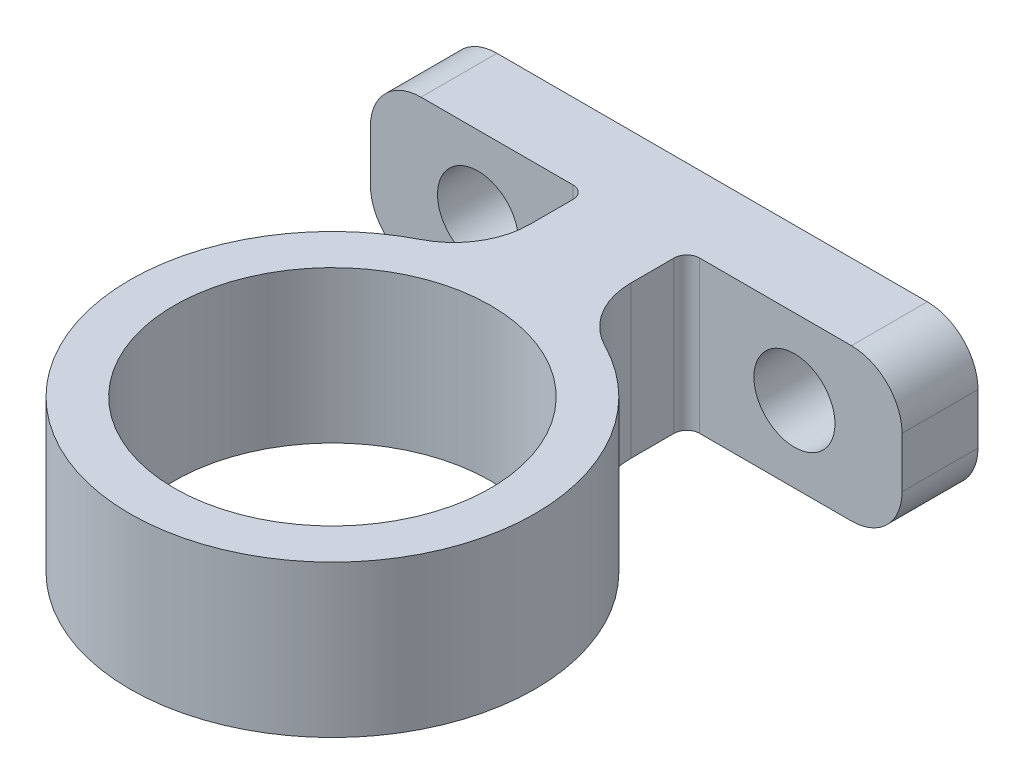
ISO-10303-21;
HEADER;
FILE_DESCRIPTION(('STEP AP214'),'2;1');
FILE_NAME('part.step','',(''),(''),'','','');
FILE_SCHEMA(('AUTOMOTIVE_DESIGN { 1 0 10303 214 1 1 1 1 }'));
ENDSEC;
DATA;
#1=APPLICATION_CONTEXT('core data for automotive mechanical design processes');
#2=APPLICATION_PROTOCOL_DEFINITION('international standard','automotive_design',2000,#1);
#3=PRODUCT_CONTEXT('',#1,'mechanical');
#4=PRODUCT('Part','Part','',(#3));
#5=PRODUCT_RELATED_PRODUCT_CATEGORY('part','',(#4));
#6=PRODUCT_DEFINITION_FORMATION('','',#4);
#7=PRODUCT_DEFINITION_CONTEXT('part definition',#1,'design');
#8=PRODUCT_DEFINITION('design','',#6,#7);
#9=PRODUCT_DEFINITION_SHAPE('','',#8);
#10=(LENGTH_UNIT() NAMED_UNIT(*) SI_UNIT(.MILLI.,.METRE.));
#11=(NAMED_UNIT(*) PLANE_ANGLE_UNIT() SI_UNIT($,.RADIAN.));
#12=(NAMED_UNIT(*) SI_UNIT($,.STERADIAN.) SOLID_ANGLE_UNIT());
#13=UNCERTAINTY_MEASURE_WITH_UNIT(LENGTH_MEASURE(1.E-05),#10,'distance_accuracy_value','');
#14=(GEOMETRIC_REPRESENTATION_CONTEXT(3) GLOBAL_UNCERTAINTY_ASSIGNED_CONTEXT((#13)) GLOBAL_UNIT_ASSIGNED_CONTEXT((#10,
#11,#12)) REPRESENTATION_CONTEXT('',''));
#15=CARTESIAN_POINT('',(0.,0.,0.));
#16=DIRECTION('',(0.,0.,1.));
#17=DIRECTION('',(1.,0.,0.));
#18=AXIS2_PLACEMENT_3D('',#15,#16,#17);
#19=CARTESIAN_POINT('',(0.,0.,3.));
#20=DIRECTION('',(0.,0.,1.));
#21=DIRECTION('',(1.,0.,0.));
#22=AXIS2_PLACEMENT_3D('',#19,#20,#21);
#23=PLANE('',#22);
#24=CARTESIAN_POINT('',(6.25,-30.2064932101433,3.));
#25=DIRECTION('',(0.,0.,1.));
#26=DIRECTION('',(1.,0.,0.));
#27=AXIS2_PLACEMENT_3D('',#24,#25,#26);
#28=CIRCLE('',#27,1.6);
#29=CARTESIAN_POINT('',(7.85,-30.2064932101433,3.));
#30=VERTEX_POINT('',#29);
#31=EDGE_CURVE('E346',#30,#30,#28,.F.);
#32=ORIENTED_EDGE('',*,*,#31,.T.);
#33=EDGE_LOOP('',(#32));
#34=FACE_BOUND('',#33,.T.);
#35=DIRECTION('',(0.,1.,0.));
#36=VECTOR('',#35,1.);
#37=CARTESIAN_POINT('',(10.5,-33.2064932101433,3.));
#38=LINE('',#37,#36);
#39=CARTESIAN_POINT('',(10.5,-31.2064932101433,3.));
#40=VERTEX_POINT('',#39);
#41=CARTESIAN_POINT('',(10.5,-29.2064932101433,3.));
#42=VERTEX_POINT('',#41);
#43=EDGE_CURVE('E282',#40,#42,#38,.T.);
#44=ORIENTED_EDGE('',*,*,#43,.T.);
#45=CARTESIAN_POINT('',(8.50000000000001,-29.2064932101433,3.));
#46=DIRECTION('',(0.,0.,1.));
#47=DIRECTION('',(1.,0.,0.));
#48=AXIS2_PLACEMENT_3D('',#45,#46,#47);
#49=CIRCLE('',#48,2.);
#50=CARTESIAN_POINT('',(8.50000000000001,-27.2064932101433,3.));
#51=VERTEX_POINT('',#50);
#52=EDGE_CURVE('E181',#42,#51,#49,.T.);
#53=ORIENTED_EDGE('',*,*,#52,.T.);
#54=DIRECTION('',(-1.,0.,0.));
#55=VECTOR('',#54,1.);
#56=CARTESIAN_POINT('',(10.5,-27.2064932101433,3.));
#57=LINE('',#56,#55);
#58=CARTESIAN_POINT('',(2.5,-27.2064932101433,3.));
#59=VERTEX_POINT('',#58);
#60=EDGE_CURVE('E173',#51,#59,#57,.T.);
#61=ORIENTED_EDGE('',*,*,#60,.T.);
#62=DIRECTION('',(0.,-1.,0.));
#63=VECTOR('',#62,1.);
#64=CARTESIAN_POINT('',(2.5,0.,3.));
#65=LINE('',#64,#63);
#66=CARTESIAN_POINT('',(2.5,-33.2064932101433,3.));
#67=VERTEX_POINT('',#66);
#68=EDGE_CURVE('E178',#59,#67,#65,.T.);
#69=ORIENTED_EDGE('',*,*,#68,.T.);
#70=DIRECTION('',(1.,0.,0.));
#71=VECTOR('',#70,1.);
#72=CARTESIAN_POINT('',(10.5,-33.2064932101433,3.));
#73=LINE('',#72,#71);
#74=CARTESIAN_POINT('',(8.50000000000001,-33.2064932101433,3.));
#75=VERTEX_POINT('',#74);
#76=EDGE_CURVE('E207',#67,#75,#73,.T.);
#77=ORIENTED_EDGE('',*,*,#76,.T.);
#78=CARTESIAN_POINT('',(8.50000000000001,-31.2064932101433,3.));
#79=DIRECTION('',(0.,0.,1.));
#80=DIRECTION('',(1.,0.,0.));
#81=AXIS2_PLACEMENT_3D('',#78,#79,#80);
#82=CIRCLE('',#81,2.);
#83=EDGE_CURVE('E257',#75,#40,#82,.T.);
#84=ORIENTED_EDGE('',*,*,#83,.T.);
#85=EDGE_LOOP('',(#44,#53,#61,#69,#77,#84));
#86=FACE_BOUND('',#85,.T.);
#87=ADVANCED_FACE('F58',(#34,#86),#23,.T.);
#88=CARTESIAN_POINT('',(10.5,-33.2064932101433,3.));
#89=DIRECTION('',(-1.,0.,0.));
#90=DIRECTION('',(0.,0.,1.));
#91=AXIS2_PLACEMENT_3D('',#88,#89,#90);
#92=PLANE('',#91);
#93=DIRECTION('',(0.,1.,0.));
#94=VECTOR('',#93,1.);
#95=CARTESIAN_POINT('',(10.5,-33.2064932101433,0.));
#96=LINE('',#95,#94);
#97=CARTESIAN_POINT('',(10.5,-31.2064932101433,0.));
#98=VERTEX_POINT('',#97);
#99=CARTESIAN_POINT('',(10.5,-29.2064932101433,0.));
#100=VERTEX_POINT('',#99);
#101=EDGE_CURVE('E280',#98,#100,#96,.T.);
#102=ORIENTED_EDGE('',*,*,#101,.T.);
#103=DIRECTION('',(0.,0.,-1.));
#104=VECTOR('',#103,1.);
#105=CARTESIAN_POINT('',(10.5,-29.2064932101433,3.));
#106=LINE('',#105,#104);
#107=EDGE_CURVE('E255',#100,#42,#106,.F.);
#108=ORIENTED_EDGE('',*,*,#107,.T.);
#109=ORIENTED_EDGE('',*,*,#43,.F.);
#110=DIRECTION('',(0.,0.,-1.));
#111=VECTOR('',#110,1.);
#112=CARTESIAN_POINT('',(10.5,-31.2064932101433,3.));
#113=LINE('',#112,#111);
#114=EDGE_CURVE('E252',#40,#98,#113,.T.);
#115=ORIENTED_EDGE('',*,*,#114,.T.);
#116=EDGE_LOOP('',(#102,#108,#109,#115));
#117=FACE_BOUND('',#116,.T.);
#118=ADVANCED_FACE('F279',(#117),#92,.F.);
#119=CARTESIAN_POINT('',(10.5,-27.2064932101433,3.));
#120=DIRECTION('',(0.,-1.,0.));
#121=DIRECTION('',(0.,0.,-1.));
#122=AXIS2_PLACEMENT_3D('',#119,#120,#121);
#123=PLANE('',#122);
#124=ORIENTED_EDGE('',*,*,#60,.F.);
#125=DIRECTION('',(0.,0.,-1.));
#126=VECTOR('',#125,1.);
#127=CARTESIAN_POINT('',(8.50000000000001,-27.2064932101433,3.));
#128=LINE('',#127,#126);
#129=CARTESIAN_POINT('',(8.50000000000001,-27.2064932101433,0.));
#130=VERTEX_POINT('',#129);
#131=EDGE_CURVE('E242',#51,#130,#128,.T.);
#132=ORIENTED_EDGE('',*,*,#131,.T.);
#133=DIRECTION('',(-1.,0.,0.));
#134=VECTOR('',#133,1.);
#135=CARTESIAN_POINT('',(10.5,-27.2064932101433,0.));
#136=LINE('',#135,#134);
#137=CARTESIAN_POINT('',(-8.49999999999999,-27.2064932101433,0.));
#138=VERTEX_POINT('',#137);
#139=EDGE_CURVE('E286',#130,#138,#136,.T.);
#140=ORIENTED_EDGE('',*,*,#139,.T.);
#141=DIRECTION('',(0.,0.,-1.));
#142=VECTOR('',#141,1.);
#143=CARTESIAN_POINT('',(-8.5,-27.2064932101433,3.));
#144=LINE('',#143,#142);
#145=CARTESIAN_POINT('',(-8.49999999999999,-27.2064932101433,3.));
#146=VERTEX_POINT('',#145);
#147=EDGE_CURVE('E240',#138,#146,#144,.F.);
#148=ORIENTED_EDGE('',*,*,#147,.T.);
#149=CARTESIAN_POINT('',(-2.5,-27.2064932101433,3.));
#150=VERTEX_POINT('',#149);
#151=EDGE_CURVE('E186',#150,#146,#57,.T.);
#152=ORIENTED_EDGE('',*,*,#151,.F.);
#153=CARTESIAN_POINT('',(-2.5,-27.2064932101433,3.5));
#154=DIRECTION('',(0.,-1.,0.));
#155=DIRECTION('',(0.,0.,-1.));
#156=AXIS2_PLACEMENT_3D('',#153,#154,#155);
#157=CIRCLE('',#156,0.5);
#158=CARTESIAN_POINT('',(-2.,-27.2064932101433,3.5));
#159=VERTEX_POINT('',#158);
#160=EDGE_CURVE('E220',#150,#159,#157,.T.);
#161=ORIENTED_EDGE('',*,*,#160,.T.);
#162=DIRECTION('',(0.,0.,1.));
#163=VECTOR('',#162,1.);
#164=CARTESIAN_POINT('',(-2.,-27.2064932101433,0.));
#165=LINE('',#164,#163);
#166=CARTESIAN_POINT('',(-2.,-27.2064932101433,5.20204102886729));
#167=VERTEX_POINT('',#166);
#168=EDGE_CURVE('E287',#159,#167,#165,.T.);
#169=ORIENTED_EDGE('',*,*,#168,.T.);
#170=CARTESIAN_POINT('',(-5.,-27.2064932101433,5.20204102886729));
#171=DIRECTION('',(0.,-1.,0.));
#172=DIRECTION('',(0.,0.,-1.));
#173=AXIS2_PLACEMENT_3D('',#170,#171,#172);
#174=CIRCLE('',#173,3.);
#175=CARTESIAN_POINT('',(-3.63636363636364,-27.2064932101433,7.87421165735803));
#176=VERTEX_POINT('',#175);
#177=EDGE_CURVE('E234',#167,#176,#174,.T.);
#178=ORIENTED_EDGE('',*,*,#177,.T.);
#179=CARTESIAN_POINT('',(0.,-27.2064932101433,15.));
#180=DIRECTION('',(0.,-1.,0.));
#181=DIRECTION('',(0.,0.,-1.));
#182=AXIS2_PLACEMENT_3D('',#179,#180,#181);
#183=CIRCLE('',#182,8.);
#184=CARTESIAN_POINT('',(3.63636363636364,-27.2064932101433,7.87421165735803));
#185=VERTEX_POINT('',#184);
#186=EDGE_CURVE('E355',#176,#185,#183,.F.);
#187=ORIENTED_EDGE('',*,*,#186,.T.);
#188=CARTESIAN_POINT('',(5.,-27.2064932101433,5.20204102886729));
#189=DIRECTION('',(0.,-1.,0.));
#190=DIRECTION('',(0.,0.,-1.));
#191=AXIS2_PLACEMENT_3D('',#188,#189,#190);
#192=CIRCLE('',#191,3.);
#193=CARTESIAN_POINT('',(2.,-27.2064932101433,5.20204102886729));
#194=VERTEX_POINT('',#193);
#195=EDGE_CURVE('E238',#185,#194,#192,.T.);
#196=ORIENTED_EDGE('',*,*,#195,.T.);
#197=DIRECTION('',(0.,0.,1.));
#198=VECTOR('',#197,1.);
#199=CARTESIAN_POINT('',(2.,-27.2064932101433,0.));
#200=LINE('',#199,#198);
#201=CARTESIAN_POINT('',(2.,-27.2064932101433,3.5));
#202=VERTEX_POINT('',#201);
#203=EDGE_CURVE('E194',#202,#194,#200,.T.);
#204=ORIENTED_EDGE('',*,*,#203,.F.);
#205=CARTESIAN_POINT('',(2.5,-27.2064932101433,3.5));
#206=DIRECTION('',(0.,-1.,0.));
#207=DIRECTION('',(0.,0.,-1.));
#208=AXIS2_PLACEMENT_3D('',#205,#206,#207);
#209=CIRCLE('',#208,0.5);
#210=EDGE_CURVE('E190',#202,#59,#209,.T.);
#211=ORIENTED_EDGE('',*,*,#210,.T.);
#212=EDGE_LOOP('',(#124,#132,#140,#148,#152,#161,#169,#178,#187,#196,#204,#211));
#213=FACE_BOUND('',#212,.T.);
#214=CARTESIAN_POINT('',(0.,-27.2064932101433,15.));
#215=DIRECTION('',(0.,-1.,0.));
#216=DIRECTION('',(0.,0.,-1.));
#217=AXIS2_PLACEMENT_3D('',#214,#215,#216);
#218=CIRCLE('',#217,6.25);
#219=CARTESIAN_POINT('',(0.,-27.2064932101433,8.75));
#220=VERTEX_POINT('',#219);
#221=EDGE_CURVE('E299',#220,#220,#218,.F.);
#222=ORIENTED_EDGE('',*,*,#221,.F.);
#223=EDGE_LOOP('',(#222));
#224=FACE_BOUND('',#223,.T.);
#225=ADVANCED_FACE('F191',(#213,#224),#123,.F.);
#226=CARTESIAN_POINT('',(-10.5,-33.2064932101433,3.));
#227=DIRECTION('',(1.,0.,0.));
#228=DIRECTION('',(0.,0.,-1.));
#229=AXIS2_PLACEMENT_3D('',#226,#227,#228);
#230=PLANE('',#229);
#231=DIRECTION('',(0.,-1.,0.));
#232=VECTOR('',#231,1.);
#233=CARTESIAN_POINT('',(-10.5,-33.2064932101433,3.));
#234=LINE('',#233,#232);
#235=CARTESIAN_POINT('',(-10.5,-29.2064932101433,3.));
#236=VERTEX_POINT('',#235);
#237=CARTESIAN_POINT('',(-10.5,-31.2064932101433,3.));
#238=VERTEX_POINT('',#237);
#239=EDGE_CURVE('E185',#236,#238,#234,.T.);
#240=ORIENTED_EDGE('',*,*,#239,.F.);
#241=DIRECTION('',(0.,0.,-1.));
#242=VECTOR('',#241,1.);
#243=CARTESIAN_POINT('',(-10.5,-29.2064932101433,3.));
#244=LINE('',#243,#242);
#245=CARTESIAN_POINT('',(-10.5,-29.2064932101433,0.));
#246=VERTEX_POINT('',#245);
#247=EDGE_CURVE('E261',#236,#246,#244,.T.);
#248=ORIENTED_EDGE('',*,*,#247,.T.);
#249=DIRECTION('',(0.,-1.,0.));
#250=VECTOR('',#249,1.);
#251=CARTESIAN_POINT('',(-10.5,-33.2064932101433,0.));
#252=LINE('',#251,#250);
#253=CARTESIAN_POINT('',(-10.5,-31.2064932101433,0.));
#254=VERTEX_POINT('',#253);
#255=EDGE_CURVE('E290',#246,#254,#252,.T.);
#256=ORIENTED_EDGE('',*,*,#255,.T.);
#257=DIRECTION('',(0.,0.,-1.));
#258=VECTOR('',#257,1.);
#259=CARTESIAN_POINT('',(-10.5,-31.2064932101433,3.));
#260=LINE('',#259,#258);
#261=EDGE_CURVE('E81',#254,#238,#260,.F.);
#262=ORIENTED_EDGE('',*,*,#261,.T.);
#263=EDGE_LOOP('',(#240,#248,#256,#262));
#264=FACE_BOUND('',#263,.T.);
#265=ADVANCED_FACE('F311',(#264),#230,.F.);
#266=CARTESIAN_POINT('',(10.5,-33.2064932101433,3.));
#267=DIRECTION('',(0.,1.,0.));
#268=DIRECTION('',(0.,0.,1.));
#269=AXIS2_PLACEMENT_3D('',#266,#267,#268);
#270=PLANE('',#269);
#271=CARTESIAN_POINT('',(-8.49999999999999,-33.2064932101433,3.));
#272=VERTEX_POINT('',#271);
#273=CARTESIAN_POINT('',(-2.5,-33.2064932101433,3.));
#274=VERTEX_POINT('',#273);
#275=EDGE_CURVE('E203',#272,#274,#73,.T.);
#276=ORIENTED_EDGE('',*,*,#275,.F.);
#277=DIRECTION('',(0.,0.,-1.));
#278=VECTOR('',#277,1.);
#279=CARTESIAN_POINT('',(-8.5,-33.2064932101433,3.));
#280=LINE('',#279,#278);
#281=CARTESIAN_POINT('',(-8.49999999999999,-33.2064932101433,0.));
#282=VERTEX_POINT('',#281);
#283=EDGE_CURVE('E12',#272,#282,#280,.T.);
#284=ORIENTED_EDGE('',*,*,#283,.T.);
#285=DIRECTION('',(1.,0.,0.));
#286=VECTOR('',#285,1.);
#287=CARTESIAN_POINT('',(10.5,-33.2064932101433,0.));
#288=LINE('',#287,#286);
#289=CARTESIAN_POINT('',(8.50000000000001,-33.2064932101433,0.));
#290=VERTEX_POINT('',#289);
#291=EDGE_CURVE('E210',#282,#290,#288,.T.);
#292=ORIENTED_EDGE('',*,*,#291,.T.);
#293=DIRECTION('',(0.,0.,-1.));
#294=VECTOR('',#293,1.);
#295=CARTESIAN_POINT('',(8.50000000000001,-33.2064932101433,3.));
#296=LINE('',#295,#294);
#297=EDGE_CURVE('E66',#290,#75,#296,.F.);
#298=ORIENTED_EDGE('',*,*,#297,.T.);
#299=ORIENTED_EDGE('',*,*,#76,.F.);
#300=CARTESIAN_POINT('',(2.5,-33.2064932101433,3.5));
#301=DIRECTION('',(0.,1.,0.));
#302=DIRECTION('',(0.,0.,1.));
#303=AXIS2_PLACEMENT_3D('',#300,#301,#302);
#304=CIRCLE('',#303,0.5);
#305=CARTESIAN_POINT('',(2.,-33.2064932101433,3.5));
#306=VERTEX_POINT('',#305);
#307=EDGE_CURVE('E198',#67,#306,#304,.T.);
#308=ORIENTED_EDGE('',*,*,#307,.T.);
#309=DIRECTION('',(0.,0.,-1.));
#310=VECTOR('',#309,1.);
#311=CARTESIAN_POINT('',(2.,-33.2064932101433,0.));
#312=LINE('',#311,#310);
#313=CARTESIAN_POINT('',(2.,-33.2064932101433,5.20204102886729));
#314=VERTEX_POINT('',#313);
#315=EDGE_CURVE('E352',#314,#306,#312,.T.);
#316=ORIENTED_EDGE('',*,*,#315,.F.);
#317=CARTESIAN_POINT('',(5.,-33.2064932101433,5.20204102886729));
#318=DIRECTION('',(0.,1.,0.));
#319=DIRECTION('',(0.,0.,1.));
#320=AXIS2_PLACEMENT_3D('',#317,#318,#319);
#321=CIRCLE('',#320,3.);
#322=CARTESIAN_POINT('',(3.63636363636364,-33.2064932101433,7.87421165735803));
#323=VERTEX_POINT('',#322);
#324=EDGE_CURVE('E236',#314,#323,#321,.T.);
#325=ORIENTED_EDGE('',*,*,#324,.T.);
#326=CARTESIAN_POINT('',(0.,-33.2064932101433,15.));
#327=DIRECTION('',(0.,-1.,0.));
#328=DIRECTION('',(0.,0.,-1.));
#329=AXIS2_PLACEMENT_3D('',#326,#327,#328);
#330=CIRCLE('',#329,8.);
#331=CARTESIAN_POINT('',(-3.63636363636364,-33.2064932101433,7.87421165735803));
#332=VERTEX_POINT('',#331);
#333=EDGE_CURVE('E362',#323,#332,#330,.T.);
#334=ORIENTED_EDGE('',*,*,#333,.T.);
#335=CARTESIAN_POINT('',(-5.,-33.2064932101433,5.20204102886729));
#336=DIRECTION('',(0.,1.,0.));
#337=DIRECTION('',(0.,0.,1.));
#338=AXIS2_PLACEMENT_3D('',#335,#336,#337);
#339=CIRCLE('',#338,3.);
#340=CARTESIAN_POINT('',(-2.,-33.2064932101433,5.20204102886729));
#341=VERTEX_POINT('',#340);
#342=EDGE_CURVE('E232',#332,#341,#339,.T.);
#343=ORIENTED_EDGE('',*,*,#342,.T.);
#344=DIRECTION('',(0.,0.,-1.));
#345=VECTOR('',#344,1.);
#346=CARTESIAN_POINT('',(-2.,-33.2064932101433,0.));
#347=LINE('',#346,#345);
#348=CARTESIAN_POINT('',(-2.,-33.2064932101433,3.5));
#349=VERTEX_POINT('',#348);
#350=EDGE_CURVE('E354',#341,#349,#347,.T.);
#351=ORIENTED_EDGE('',*,*,#350,.T.);
#352=CARTESIAN_POINT('',(-2.5,-33.2064932101433,3.5));
#353=DIRECTION('',(0.,1.,0.));
#354=DIRECTION('',(0.,0.,1.));
#355=AXIS2_PLACEMENT_3D('',#352,#353,#354);
#356=CIRCLE('',#355,0.5);
#357=EDGE_CURVE('E197',#349,#274,#356,.T.);
#358=ORIENTED_EDGE('',*,*,#357,.T.);
#359=EDGE_LOOP('',(#276,#284,#292,#298,#299,#308,#316,#325,#334,#343,#351,#358));
#360=FACE_BOUND('',#359,.T.);
#361=CARTESIAN_POINT('',(0.,-33.2064932101433,15.));
#362=DIRECTION('',(0.,-1.,0.));
#363=DIRECTION('',(0.,0.,-1.));
#364=AXIS2_PLACEMENT_3D('',#361,#362,#363);
#365=CIRCLE('',#364,6.25);
#366=CARTESIAN_POINT('',(0.,-33.2064932101433,8.75));
#367=VERTEX_POINT('',#366);
#368=EDGE_CURVE('E360',#367,#367,#365,.T.);
#369=ORIENTED_EDGE('',*,*,#368,.F.);
#370=EDGE_LOOP('',(#369));
#371=FACE_BOUND('',#370,.T.);
#372=ADVANCED_FACE('F269',(#360,#371),#270,.F.);
#373=CARTESIAN_POINT('',(-6.25,-30.2064932101433,3.));
#374=DIRECTION('',(0.,0.,1.));
#375=DIRECTION('',(1.,0.,0.));
#376=AXIS2_PLACEMENT_3D('',#373,#374,#375);
#377=CIRCLE('',#376,1.6);
#378=CARTESIAN_POINT('',(-4.65,-30.2064932101433,3.));
#379=VERTEX_POINT('',#378);
#380=EDGE_CURVE('E340',#379,#379,#377,.F.);
#381=ORIENTED_EDGE('',*,*,#380,.T.);
#382=EDGE_LOOP('',(#381));
#383=FACE_BOUND('',#382,.T.);
#384=ORIENTED_EDGE('',*,*,#151,.T.);
#385=CARTESIAN_POINT('',(-8.49999999999999,-29.2064932101433,3.));
#386=DIRECTION('',(0.,0.,1.));
#387=DIRECTION('',(1.,0.,0.));
#388=AXIS2_PLACEMENT_3D('',#385,#386,#387);
#389=CIRCLE('',#388,2.);
#390=EDGE_CURVE('E265',#146,#236,#389,.T.);
#391=ORIENTED_EDGE('',*,*,#390,.T.);
#392=ORIENTED_EDGE('',*,*,#239,.T.);
#393=CARTESIAN_POINT('',(-8.5,-31.2064932101433,3.));
#394=DIRECTION('',(0.,0.,1.));
#395=DIRECTION('',(1.,0.,0.));
#396=AXIS2_PLACEMENT_3D('',#393,#394,#395);
#397=CIRCLE('',#396,2.);
#398=EDGE_CURVE('E73',#238,#272,#397,.T.);
#399=ORIENTED_EDGE('',*,*,#398,.T.);
#400=ORIENTED_EDGE('',*,*,#275,.T.);
#401=DIRECTION('',(0.,-1.,0.));
#402=VECTOR('',#401,1.);
#403=CARTESIAN_POINT('',(-2.5,-27.2064932101433,3.));
#404=LINE('',#403,#402);
#405=EDGE_CURVE('E215',#274,#150,#404,.F.);
#406=ORIENTED_EDGE('',*,*,#405,.T.);
#407=EDGE_LOOP('',(#384,#391,#392,#399,#400,#406));
#408=FACE_BOUND('',#407,.T.);
#409=ADVANCED_FACE('F301',(#383,#408),#23,.T.);
#410=CARTESIAN_POINT('',(0.,0.,0.));
#411=DIRECTION('',(0.,0.,1.));
#412=DIRECTION('',(1.,0.,0.));
#413=AXIS2_PLACEMENT_3D('',#410,#411,#412);
#414=PLANE('',#413);
#415=CARTESIAN_POINT('',(6.25,-30.2064932101433,0.));
#416=DIRECTION('',(0.,0.,-1.));
#417=DIRECTION('',(-1.,0.,0.));
#418=AXIS2_PLACEMENT_3D('',#415,#416,#417);
#419=CIRCLE('',#418,1.6);
#420=CARTESIAN_POINT('',(4.65,-30.2064932101433,0.));
#421=VERTEX_POINT('',#420);
#422=EDGE_CURVE('E342',#421,#421,#419,.T.);
#423=ORIENTED_EDGE('',*,*,#422,.F.);
#424=EDGE_LOOP('',(#423));
#425=FACE_BOUND('',#424,.T.);
#426=CARTESIAN_POINT('',(-6.25,-30.2064932101433,0.));
#427=DIRECTION('',(0.,0.,-1.));
#428=DIRECTION('',(1.,0.,0.));
#429=AXIS2_PLACEMENT_3D('',#426,#427,#428);
#430=CIRCLE('',#429,1.6);
#431=CARTESIAN_POINT('',(-4.65,-30.2064932101433,0.));
#432=VERTEX_POINT('',#431);
#433=EDGE_CURVE('E343',#432,#432,#430,.T.);
#434=ORIENTED_EDGE('',*,*,#433,.F.);
#435=EDGE_LOOP('',(#434));
#436=FACE_BOUND('',#435,.T.);
#437=ORIENTED_EDGE('',*,*,#139,.F.);
#438=CARTESIAN_POINT('',(8.50000000000001,-29.2064932101433,0.));
#439=DIRECTION('',(0.,0.,1.));
#440=DIRECTION('',(1.,0.,0.));
#441=AXIS2_PLACEMENT_3D('',#438,#439,#440);
#442=CIRCLE('',#441,2.);
#443=EDGE_CURVE('E250',#130,#100,#442,.F.);
#444=ORIENTED_EDGE('',*,*,#443,.T.);
#445=ORIENTED_EDGE('',*,*,#101,.F.);
#446=CARTESIAN_POINT('',(8.50000000000001,-31.2064932101433,0.));
#447=DIRECTION('',(0.,0.,1.));
#448=DIRECTION('',(1.,0.,0.));
#449=AXIS2_PLACEMENT_3D('',#446,#447,#448);
#450=CIRCLE('',#449,2.);
#451=EDGE_CURVE('E244',#98,#290,#450,.F.);
#452=ORIENTED_EDGE('',*,*,#451,.T.);
#453=ORIENTED_EDGE('',*,*,#291,.F.);
#454=CARTESIAN_POINT('',(-8.5,-31.2064932101433,0.));
#455=DIRECTION('',(0.,0.,1.));
#456=DIRECTION('',(1.,0.,0.));
#457=AXIS2_PLACEMENT_3D('',#454,#455,#456);
#458=CIRCLE('',#457,2.);
#459=EDGE_CURVE('E246',#282,#254,#458,.F.);
#460=ORIENTED_EDGE('',*,*,#459,.T.);
#461=ORIENTED_EDGE('',*,*,#255,.F.);
#462=CARTESIAN_POINT('',(-8.49999999999999,-29.2064932101433,0.));
#463=DIRECTION('',(0.,0.,1.));
#464=DIRECTION('',(1.,0.,0.));
#465=AXIS2_PLACEMENT_3D('',#462,#463,#464);
#466=CIRCLE('',#465,2.);
#467=EDGE_CURVE('E248',#246,#138,#466,.F.);
#468=ORIENTED_EDGE('',*,*,#467,.T.);
#469=EDGE_LOOP('',(#437,#444,#445,#452,#453,#460,#461,#468));
#470=FACE_BOUND('',#469,.T.);
#471=ADVANCED_FACE('F285',(#425,#436,#470),#414,.F.);
#472=CARTESIAN_POINT('',(2.,-4.57907621217374,0.));
#473=DIRECTION('',(-1.,0.,0.));
#474=DIRECTION('',(0.,0.,1.));
#475=AXIS2_PLACEMENT_3D('',#472,#473,#474);
#476=PLANE('',#475);
#477=ORIENTED_EDGE('',*,*,#203,.T.);
#478=DIRECTION('',(0.,-1.,0.));
#479=VECTOR('',#478,1.);
#480=CARTESIAN_POINT('',(2.,-4.57907621217374,5.20204102886729));
#481=LINE('',#480,#479);
#482=EDGE_CURVE('E229',#194,#314,#481,.T.);
#483=ORIENTED_EDGE('',*,*,#482,.T.);
#484=ORIENTED_EDGE('',*,*,#315,.T.);
#485=DIRECTION('',(0.,-1.,0.));
#486=VECTOR('',#485,1.);
#487=CARTESIAN_POINT('',(2.,-4.57907621217374,3.5));
#488=LINE('',#487,#486);
#489=EDGE_CURVE('E202',#306,#202,#488,.F.);
#490=ORIENTED_EDGE('',*,*,#489,.T.);
#491=EDGE_LOOP('',(#477,#483,#484,#490));
#492=FACE_BOUND('',#491,.T.);
#493=ADVANCED_FACE('F335',(#492),#476,.F.);
#494=CARTESIAN_POINT('',(-2.,-4.57907621217374,0.));
#495=DIRECTION('',(-1.,0.,0.));
#496=DIRECTION('',(0.,0.,1.));
#497=AXIS2_PLACEMENT_3D('',#494,#495,#496);
#498=PLANE('',#497);
#499=ORIENTED_EDGE('',*,*,#350,.F.);
#500=DIRECTION('',(0.,1.,0.));
#501=VECTOR('',#500,1.);
#502=CARTESIAN_POINT('',(-2.,-27.2064932101433,5.20204102886729));
#503=LINE('',#502,#501);
#504=EDGE_CURVE('E227',#341,#167,#503,.T.);
#505=ORIENTED_EDGE('',*,*,#504,.T.);
#506=ORIENTED_EDGE('',*,*,#168,.F.);
#507=DIRECTION('',(0.,-1.,0.));
#508=VECTOR('',#507,1.);
#509=CARTESIAN_POINT('',(-2.,-33.2064932101433,3.5));
#510=LINE('',#509,#508);
#511=EDGE_CURVE('E205',#159,#349,#510,.T.);
#512=ORIENTED_EDGE('',*,*,#511,.T.);
#513=EDGE_LOOP('',(#499,#505,#506,#512));
#514=FACE_BOUND('',#513,.T.);
#515=ADVANCED_FACE('F371',(#514),#498,.T.);
#516=CARTESIAN_POINT('',(0.,-4.57907621217374,15.));
#517=DIRECTION('',(0.,-1.,0.));
#518=DIRECTION('',(0.,0.,-1.));
#519=AXIS2_PLACEMENT_3D('',#516,#517,#518);
#520=CYLINDRICAL_SURFACE('',#519,6.25);
#521=ORIENTED_EDGE('',*,*,#221,.T.);
#522=EDGE_LOOP('',(#521));
#523=FACE_BOUND('',#522,.T.);
#524=ORIENTED_EDGE('',*,*,#368,.T.);
#525=EDGE_LOOP('',(#524));
#526=FACE_BOUND('',#525,.T.);
#527=ADVANCED_FACE('F368',(#523,#526),#520,.F.);
#528=CARTESIAN_POINT('',(0.,-4.57907621217374,15.));
#529=DIRECTION('',(0.,-1.,0.));
#530=DIRECTION('',(0.,0.,-1.));
#531=AXIS2_PLACEMENT_3D('',#528,#529,#530);
#532=CYLINDRICAL_SURFACE('',#531,8.);
#533=ORIENTED_EDGE('',*,*,#186,.F.);
#534=DIRECTION('',(0.,-1.,0.));
#535=VECTOR('',#534,1.);
#536=CARTESIAN_POINT('',(-3.63636363636364,-4.57907621217374,7.87421165735803));
#537=LINE('',#536,#535);
#538=EDGE_CURVE('E224',#176,#332,#537,.T.);
#539=ORIENTED_EDGE('',*,*,#538,.T.);
#540=ORIENTED_EDGE('',*,*,#333,.F.);
#541=DIRECTION('',(0.,-1.,0.));
#542=VECTOR('',#541,1.);
#543=CARTESIAN_POINT('',(3.63636363636364,-4.57907621217374,7.87421165735803));
#544=LINE('',#543,#542);
#545=EDGE_CURVE('E222',#323,#185,#544,.F.);
#546=ORIENTED_EDGE('',*,*,#545,.T.);
#547=EDGE_LOOP('',(#533,#539,#540,#546));
#548=FACE_BOUND('',#547,.T.);
#549=ADVANCED_FACE('F337',(#548),#532,.T.);
#550=CARTESIAN_POINT('',(-6.25,-30.2064932101433,7.52548339959391));
#551=DIRECTION('',(0.,0.,-1.));
#552=DIRECTION('',(-1.,0.,0.));
#553=AXIS2_PLACEMENT_3D('',#550,#551,#552);
#554=CYLINDRICAL_SURFACE('',#553,1.6);
#555=ORIENTED_EDGE('',*,*,#433,.T.);
#556=EDGE_LOOP('',(#555));
#557=FACE_BOUND('',#556,.T.);
#558=ORIENTED_EDGE('',*,*,#380,.F.);
#559=EDGE_LOOP('',(#558));
#560=FACE_BOUND('',#559,.T.);
#561=ADVANCED_FACE('F378',(#557,#560),#554,.F.);
#562=CARTESIAN_POINT('',(6.25,-30.2064932101433,7.52548339959391));
#563=DIRECTION('',(0.,0.,-1.));
#564=DIRECTION('',(-1.,0.,0.));
#565=AXIS2_PLACEMENT_3D('',#562,#563,#564);
#566=CYLINDRICAL_SURFACE('',#565,1.6);
#567=ORIENTED_EDGE('',*,*,#422,.T.);
#568=EDGE_LOOP('',(#567));
#569=FACE_BOUND('',#568,.T.);
#570=ORIENTED_EDGE('',*,*,#31,.F.);
#571=EDGE_LOOP('',(#570));
#572=FACE_BOUND('',#571,.T.);
#573=ADVANCED_FACE('F390',(#569,#572),#566,.F.);
#574=CARTESIAN_POINT('',(2.5,0.,3.5));
#575=DIRECTION('',(0.,-1.,0.));
#576=DIRECTION('',(0.,0.,-1.));
#577=AXIS2_PLACEMENT_3D('',#574,#575,#576);
#578=CYLINDRICAL_SURFACE('',#577,0.5);
#579=ORIENTED_EDGE('',*,*,#210,.F.);
#580=ORIENTED_EDGE('',*,*,#489,.F.);
#581=ORIENTED_EDGE('',*,*,#307,.F.);
#582=ORIENTED_EDGE('',*,*,#68,.F.);
#583=EDGE_LOOP('',(#579,#580,#581,#582));
#584=FACE_BOUND('',#583,.T.);
#585=ADVANCED_FACE('F200',(#584),#578,.F.);
#586=CARTESIAN_POINT('',(-2.5,-4.57907621217374,3.5));
#587=DIRECTION('',(0.,1.,0.));
#588=DIRECTION('',(0.,0.,1.));
#589=AXIS2_PLACEMENT_3D('',#586,#587,#588);
#590=CYLINDRICAL_SURFACE('',#589,0.5);
#591=ORIENTED_EDGE('',*,*,#160,.F.);
#592=ORIENTED_EDGE('',*,*,#405,.F.);
#593=ORIENTED_EDGE('',*,*,#357,.F.);
#594=ORIENTED_EDGE('',*,*,#511,.F.);
#595=EDGE_LOOP('',(#591,#592,#593,#594));
#596=FACE_BOUND('',#595,.T.);
#597=ADVANCED_FACE('F397',(#596),#590,.F.);
#598=CARTESIAN_POINT('',(-5.,-4.57907621217374,5.20204102886729));
#599=DIRECTION('',(0.,-1.,0.));
#600=DIRECTION('',(0.,0.,-1.));
#601=AXIS2_PLACEMENT_3D('',#598,#599,#600);
#602=CYLINDRICAL_SURFACE('',#601,3.);
#603=ORIENTED_EDGE('',*,*,#177,.F.);
#604=ORIENTED_EDGE('',*,*,#504,.F.);
#605=ORIENTED_EDGE('',*,*,#342,.F.);
#606=ORIENTED_EDGE('',*,*,#538,.F.);
#607=EDGE_LOOP('',(#603,#604,#605,#606));
#608=FACE_BOUND('',#607,.T.);
#609=ADVANCED_FACE('F407',(#608),#602,.F.);
#610=CARTESIAN_POINT('',(5.,-4.57907621217374,5.20204102886729));
#611=DIRECTION('',(0.,-1.,0.));
#612=DIRECTION('',(0.,0.,-1.));
#613=AXIS2_PLACEMENT_3D('',#610,#611,#612);
#614=CYLINDRICAL_SURFACE('',#613,3.);
#615=ORIENTED_EDGE('',*,*,#195,.F.);
#616=ORIENTED_EDGE('',*,*,#545,.F.);
#617=ORIENTED_EDGE('',*,*,#324,.F.);
#618=ORIENTED_EDGE('',*,*,#482,.F.);
#619=EDGE_LOOP('',(#615,#616,#617,#618));
#620=FACE_BOUND('',#619,.T.);
#621=ADVANCED_FACE('F413',(#620),#614,.F.);
#622=CARTESIAN_POINT('',(8.50000000000001,-29.2064932101433,3.));
#623=DIRECTION('',(0.,0.,-1.));
#624=DIRECTION('',(-1.,0.,0.));
#625=AXIS2_PLACEMENT_3D('',#622,#623,#624);
#626=CYLINDRICAL_SURFACE('',#625,2.);
#627=ORIENTED_EDGE('',*,*,#52,.F.);
#628=ORIENTED_EDGE('',*,*,#107,.F.);
#629=ORIENTED_EDGE('',*,*,#443,.F.);
#630=ORIENTED_EDGE('',*,*,#131,.F.);
#631=EDGE_LOOP('',(#627,#628,#629,#630));
#632=FACE_BOUND('',#631,.T.);
#633=ADVANCED_FACE('F417',(#632),#626,.T.);
#634=CARTESIAN_POINT('',(-8.49999999999999,-29.2064932101433,3.));
#635=DIRECTION('',(0.,0.,-1.));
#636=DIRECTION('',(-1.,0.,0.));
#637=AXIS2_PLACEMENT_3D('',#634,#635,#636);
#638=CYLINDRICAL_SURFACE('',#637,2.);
#639=ORIENTED_EDGE('',*,*,#390,.F.);
#640=ORIENTED_EDGE('',*,*,#147,.F.);
#641=ORIENTED_EDGE('',*,*,#467,.F.);
#642=ORIENTED_EDGE('',*,*,#247,.F.);
#643=EDGE_LOOP('',(#639,#640,#641,#642));
#644=FACE_BOUND('',#643,.T.);
#645=ADVANCED_FACE('F310',(#644),#638,.T.);
#646=CARTESIAN_POINT('',(-8.5,-31.2064932101433,3.));
#647=DIRECTION('',(0.,0.,-1.));
#648=DIRECTION('',(-1.,0.,0.));
#649=AXIS2_PLACEMENT_3D('',#646,#647,#648);
#650=CYLINDRICAL_SURFACE('',#649,2.);
#651=ORIENTED_EDGE('',*,*,#398,.F.);
#652=ORIENTED_EDGE('',*,*,#261,.F.);
#653=ORIENTED_EDGE('',*,*,#459,.F.);
#654=ORIENTED_EDGE('',*,*,#283,.F.);
#655=EDGE_LOOP('',(#651,#652,#653,#654));
#656=FACE_BOUND('',#655,.T.);
#657=ADVANCED_FACE('F306',(#656),#650,.T.);
#658=CARTESIAN_POINT('',(8.50000000000001,-31.2064932101433,3.));
#659=DIRECTION('',(0.,0.,-1.));
#660=DIRECTION('',(-1.,0.,0.));
#661=AXIS2_PLACEMENT_3D('',#658,#659,#660);
#662=CYLINDRICAL_SURFACE('',#661,2.);
#663=ORIENTED_EDGE('',*,*,#83,.F.);
#664=ORIENTED_EDGE('',*,*,#297,.F.);
#665=ORIENTED_EDGE('',*,*,#451,.F.);
#666=ORIENTED_EDGE('',*,*,#114,.F.);
#667=EDGE_LOOP('',(#663,#664,#665,#666));
#668=FACE_BOUND('',#667,.T.);
#669=ADVANCED_FACE('F60',(#668),#662,.T.);
#670=CLOSED_SHELL('',(#87,#118,#225,#265,#372,#409,#471,#493,#515,#527,#549,#561,#573,#585,#597,
#609,#621,#633,#645,#657,#669));
#671=MANIFOLD_SOLID_BREP('B2',#670);
#672=ADVANCED_BREP_SHAPE_REPRESENTATION('',(#18,#671),#14);
#673=SHAPE_DEFINITION_REPRESENTATION(#9,#672);
ENDSEC;
END-ISO-10303-21;
